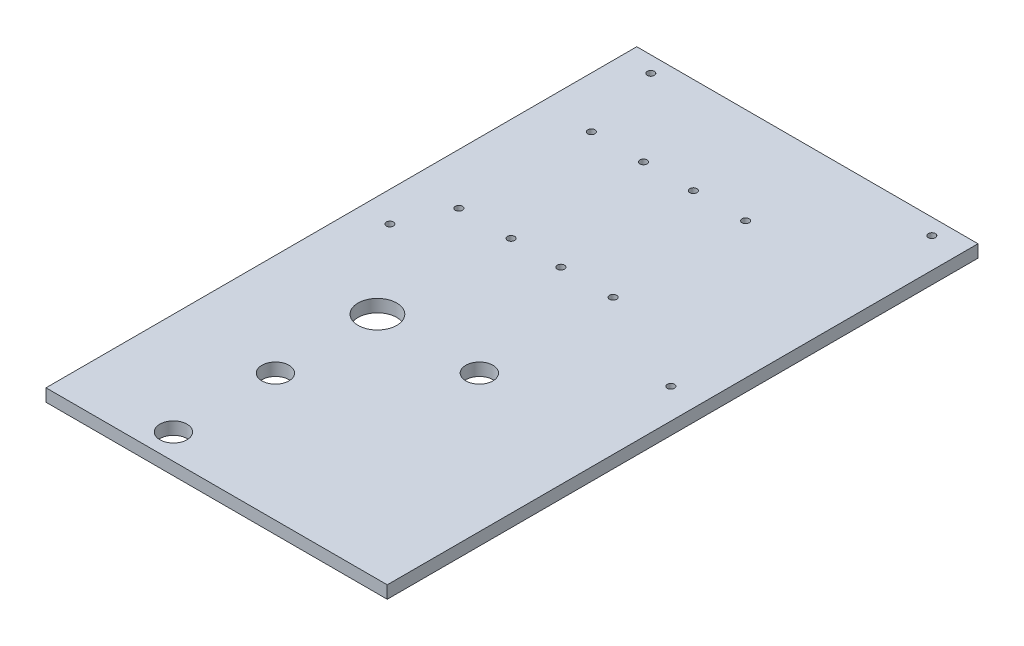
ISO-10303-21;
HEADER;
FILE_DESCRIPTION(('STEP AP214'),'2;1');
FILE_NAME('part.step','',(''),(''),'','','');
FILE_SCHEMA(('AUTOMOTIVE_DESIGN { 1 0 10303 214 1 1 1 1 }'));
ENDSEC;
DATA;
#1=APPLICATION_CONTEXT('core data for automotive mechanical design processes');
#2=APPLICATION_PROTOCOL_DEFINITION('international standard','automotive_design',2000,#1);
#3=PRODUCT_CONTEXT('',#1,'mechanical');
#4=PRODUCT('Part','Part','',(#3));
#5=PRODUCT_RELATED_PRODUCT_CATEGORY('part','',(#4));
#6=PRODUCT_DEFINITION_FORMATION('','',#4);
#7=PRODUCT_DEFINITION_CONTEXT('part definition',#1,'design');
#8=PRODUCT_DEFINITION('design','',#6,#7);
#9=PRODUCT_DEFINITION_SHAPE('','',#8);
#10=(LENGTH_UNIT() NAMED_UNIT(*) SI_UNIT(.MILLI.,.METRE.));
#11=(NAMED_UNIT(*) PLANE_ANGLE_UNIT() SI_UNIT($,.RADIAN.));
#12=(NAMED_UNIT(*) SI_UNIT($,.STERADIAN.) SOLID_ANGLE_UNIT());
#13=UNCERTAINTY_MEASURE_WITH_UNIT(LENGTH_MEASURE(1.E-05),#10,'distance_accuracy_value','');
#14=(GEOMETRIC_REPRESENTATION_CONTEXT(3) GLOBAL_UNCERTAINTY_ASSIGNED_CONTEXT((#13)) GLOBAL_UNIT_ASSIGNED_CONTEXT((#10,
#11,#12)) REPRESENTATION_CONTEXT('',''));
#15=CARTESIAN_POINT('',(0.,0.,0.));
#16=DIRECTION('',(0.,0.,1.));
#17=DIRECTION('',(1.,0.,0.));
#18=AXIS2_PLACEMENT_3D('',#15,#16,#17);
#19=CARTESIAN_POINT('',(0.,3.125,0.));
#20=DIRECTION('',(0.,-1.,0.));
#21=DIRECTION('',(0.,0.,-1.));
#22=AXIS2_PLACEMENT_3D('',#19,#20,#21);
#23=PLANE('',#22);
#24=DIRECTION('',(0.,0.,1.));
#25=VECTOR('',#24,1.);
#26=CARTESIAN_POINT('',(0.,3.125,0.));
#27=LINE('',#26,#25);
#28=CARTESIAN_POINT('',(0.,3.125,-147.15));
#29=VERTEX_POINT('',#28);
#30=CARTESIAN_POINT('',(0.,3.125,0.));
#31=VERTEX_POINT('',#30);
#32=EDGE_CURVE('E96',#29,#31,#27,.T.);
#33=ORIENTED_EDGE('',*,*,#32,.T.);
#34=DIRECTION('',(1.,0.,0.));
#35=VECTOR('',#34,1.);
#36=CARTESIAN_POINT('',(0.,3.125,0.));
#37=LINE('',#36,#35);
#38=CARTESIAN_POINT('',(85.,3.125,0.));
#39=VERTEX_POINT('',#38);
#40=EDGE_CURVE('E91',#31,#39,#37,.T.);
#41=ORIENTED_EDGE('',*,*,#40,.T.);
#42=DIRECTION('',(0.,0.,-1.));
#43=VECTOR('',#42,1.);
#44=CARTESIAN_POINT('',(85.,3.125,0.));
#45=LINE('',#44,#43);
#46=CARTESIAN_POINT('',(85.,3.125,-147.15));
#47=VERTEX_POINT('',#46);
#48=EDGE_CURVE('E94',#39,#47,#45,.T.);
#49=ORIENTED_EDGE('',*,*,#48,.T.);
#50=DIRECTION('',(-1.,0.,0.));
#51=VECTOR('',#50,1.);
#52=CARTESIAN_POINT('',(0.,3.125,-147.15));
#53=LINE('',#52,#51);
#54=EDGE_CURVE('E61',#47,#29,#53,.T.);
#55=ORIENTED_EDGE('',*,*,#54,.T.);
#56=EDGE_LOOP('',(#33,#41,#49,#55));
#57=FACE_BOUND('',#56,.T.);
#58=CARTESIAN_POINT('',(25.4,3.125,-57.15));
#59=DIRECTION('',(0.,1.,0.));
#60=DIRECTION('',(0.,0.,1.));
#61=AXIS2_PLACEMENT_3D('',#58,#59,#60);
#62=CIRCLE('',#61,4.826);
#63=CARTESIAN_POINT('',(25.4,3.125,-52.324));
#64=VERTEX_POINT('',#63);
#65=EDGE_CURVE('E116',#64,#64,#62,.T.);
#66=ORIENTED_EDGE('',*,*,#65,.F.);
#67=EDGE_LOOP('',(#66));
#68=FACE_BOUND('',#67,.T.);
#69=CARTESIAN_POINT('',(25.4,3.125,-31.75));
#70=DIRECTION('',(0.,1.,0.));
#71=DIRECTION('',(0.,0.,1.));
#72=AXIS2_PLACEMENT_3D('',#69,#70,#71);
#73=CIRCLE('',#72,3.38);
#74=CARTESIAN_POINT('',(25.4,3.125,-28.37));
#75=VERTEX_POINT('',#74);
#76=EDGE_CURVE('E138',#75,#75,#73,.T.);
#77=ORIENTED_EDGE('',*,*,#76,.F.);
#78=EDGE_LOOP('',(#77));
#79=FACE_BOUND('',#78,.T.);
#80=CARTESIAN_POINT('',(25.4,3.125,-6.35));
#81=DIRECTION('',(0.,1.,0.));
#82=DIRECTION('',(0.,0.,1.));
#83=AXIS2_PLACEMENT_3D('',#80,#81,#82);
#84=CIRCLE('',#83,3.38);
#85=CARTESIAN_POINT('',(25.4,3.125,-2.97));
#86=VERTEX_POINT('',#85);
#87=EDGE_CURVE('E146',#86,#86,#84,.T.);
#88=ORIENTED_EDGE('',*,*,#87,.F.);
#89=EDGE_LOOP('',(#88));
#90=FACE_BOUND('',#89,.T.);
#91=CARTESIAN_POINT('',(50.8,3.125,-57.15));
#92=DIRECTION('',(0.,1.,0.));
#93=DIRECTION('',(0.,0.,1.));
#94=AXIS2_PLACEMENT_3D('',#91,#92,#93);
#95=CIRCLE('',#94,3.38);
#96=CARTESIAN_POINT('',(50.8,3.125,-53.77));
#97=VERTEX_POINT('',#96);
#98=EDGE_CURVE('E154',#97,#97,#95,.T.);
#99=ORIENTED_EDGE('',*,*,#98,.F.);
#100=EDGE_LOOP('',(#99));
#101=FACE_BOUND('',#100,.T.);
#102=CARTESIAN_POINT('',(7.5,3.125,-143.15));
#103=DIRECTION('',(0.,1.,0.));
#104=DIRECTION('',(0.,0.,1.));
#105=AXIS2_PLACEMENT_3D('',#102,#103,#104);
#106=CIRCLE('',#105,0.889000000000012);
#107=CARTESIAN_POINT('',(7.5,3.125,-142.261));
#108=VERTEX_POINT('',#107);
#109=EDGE_CURVE('E162',#108,#108,#106,.T.);
#110=ORIENTED_EDGE('',*,*,#109,.F.);
#111=EDGE_LOOP('',(#110));
#112=FACE_BOUND('',#111,.T.);
#113=CARTESIAN_POINT('',(77.5,3.125,-143.15));
#114=DIRECTION('',(0.,1.,0.));
#115=DIRECTION('',(0.,0.,1.));
#116=AXIS2_PLACEMENT_3D('',#113,#114,#115);
#117=CIRCLE('',#116,0.889000000000006);
#118=CARTESIAN_POINT('',(77.5,3.125,-142.261));
#119=VERTEX_POINT('',#118);
#120=EDGE_CURVE('E170',#119,#119,#117,.T.);
#121=ORIENTED_EDGE('',*,*,#120,.F.);
#122=EDGE_LOOP('',(#121));
#123=FACE_BOUND('',#122,.T.);
#124=CARTESIAN_POINT('',(77.5,3.125,-78.15));
#125=DIRECTION('',(0.,1.,0.));
#126=DIRECTION('',(0.,0.,1.));
#127=AXIS2_PLACEMENT_3D('',#124,#125,#126);
#128=CIRCLE('',#127,0.889000000000002);
#129=CARTESIAN_POINT('',(77.5,3.125,-77.261));
#130=VERTEX_POINT('',#129);
#131=EDGE_CURVE('E178',#130,#130,#128,.T.);
#132=ORIENTED_EDGE('',*,*,#131,.F.);
#133=EDGE_LOOP('',(#132));
#134=FACE_BOUND('',#133,.T.);
#135=CARTESIAN_POINT('',(7.50000000000001,3.125,-78.15));
#136=DIRECTION('',(0.,1.,0.));
#137=DIRECTION('',(0.,0.,1.));
#138=AXIS2_PLACEMENT_3D('',#135,#136,#137);
#139=CIRCLE('',#138,0.889);
#140=CARTESIAN_POINT('',(7.50000000000001,3.125,-77.261));
#141=VERTEX_POINT('',#140);
#142=EDGE_CURVE('E186',#141,#141,#139,.T.);
#143=ORIENTED_EDGE('',*,*,#142,.F.);
#144=EDGE_LOOP('',(#143));
#145=FACE_BOUND('',#144,.T.);
#146=CARTESIAN_POINT('',(12.7,3.125,-123.15));
#147=DIRECTION('',(0.,1.,0.));
#148=DIRECTION('',(0.,0.,1.));
#149=AXIS2_PLACEMENT_3D('',#146,#147,#148);
#150=CIRCLE('',#149,0.889000000000021);
#151=CARTESIAN_POINT('',(12.7,3.125,-122.261));
#152=VERTEX_POINT('',#151);
#153=EDGE_CURVE('E194',#152,#152,#150,.T.);
#154=ORIENTED_EDGE('',*,*,#153,.F.);
#155=EDGE_LOOP('',(#154));
#156=FACE_BOUND('',#155,.T.);
#157=CARTESIAN_POINT('',(25.7,3.125,-90.15));
#158=DIRECTION('',(0.,1.,0.));
#159=DIRECTION('',(0.,0.,1.));
#160=AXIS2_PLACEMENT_3D('',#157,#158,#159);
#161=CIRCLE('',#160,0.888999999999996);
#162=CARTESIAN_POINT('',(25.7,3.125,-89.261));
#163=VERTEX_POINT('',#162);
#164=EDGE_CURVE('E202',#163,#163,#161,.T.);
#165=ORIENTED_EDGE('',*,*,#164,.F.);
#166=EDGE_LOOP('',(#165));
#167=FACE_BOUND('',#166,.T.);
#168=CARTESIAN_POINT('',(25.7,3.125,-123.15));
#169=DIRECTION('',(0.,1.,0.));
#170=DIRECTION('',(0.,0.,1.));
#171=AXIS2_PLACEMENT_3D('',#168,#169,#170);
#172=CIRCLE('',#171,0.889000000000026);
#173=CARTESIAN_POINT('',(25.7,3.125,-122.261));
#174=VERTEX_POINT('',#173);
#175=EDGE_CURVE('E210',#174,#174,#172,.T.);
#176=ORIENTED_EDGE('',*,*,#175,.F.);
#177=EDGE_LOOP('',(#176));
#178=FACE_BOUND('',#177,.T.);
#179=CARTESIAN_POINT('',(12.7,3.125,-90.15));
#180=DIRECTION('',(0.,1.,0.));
#181=DIRECTION('',(0.,0.,1.));
#182=AXIS2_PLACEMENT_3D('',#179,#180,#181);
#183=CIRCLE('',#182,0.888999999999996);
#184=CARTESIAN_POINT('',(12.7,3.125,-89.261));
#185=VERTEX_POINT('',#184);
#186=EDGE_CURVE('E218',#185,#185,#183,.T.);
#187=ORIENTED_EDGE('',*,*,#186,.F.);
#188=EDGE_LOOP('',(#187));
#189=FACE_BOUND('',#188,.T.);
#190=CARTESIAN_POINT('',(38.1,3.125,-123.15));
#191=DIRECTION('',(0.,1.,0.));
#192=DIRECTION('',(0.,0.,1.));
#193=AXIS2_PLACEMENT_3D('',#190,#191,#192);
#194=CIRCLE('',#193,0.889000000000026);
#195=CARTESIAN_POINT('',(38.1,3.125,-122.261));
#196=VERTEX_POINT('',#195);
#197=EDGE_CURVE('E226',#196,#196,#194,.T.);
#198=ORIENTED_EDGE('',*,*,#197,.F.);
#199=EDGE_LOOP('',(#198));
#200=FACE_BOUND('',#199,.T.);
#201=CARTESIAN_POINT('',(51.1,3.125,-90.15));
#202=DIRECTION('',(0.,1.,0.));
#203=DIRECTION('',(0.,0.,1.));
#204=AXIS2_PLACEMENT_3D('',#201,#202,#203);
#205=CIRCLE('',#204,0.888999999999989);
#206=CARTESIAN_POINT('',(51.1,3.125,-89.261));
#207=VERTEX_POINT('',#206);
#208=EDGE_CURVE('E234',#207,#207,#205,.T.);
#209=ORIENTED_EDGE('',*,*,#208,.F.);
#210=EDGE_LOOP('',(#209));
#211=FACE_BOUND('',#210,.T.);
#212=CARTESIAN_POINT('',(51.1,3.125,-123.15));
#213=DIRECTION('',(0.,1.,0.));
#214=DIRECTION('',(0.,0.,1.));
#215=AXIS2_PLACEMENT_3D('',#212,#213,#214);
#216=CIRCLE('',#215,0.889000000000026);
#217=CARTESIAN_POINT('',(51.1,3.125,-122.261));
#218=VERTEX_POINT('',#217);
#219=EDGE_CURVE('E242',#218,#218,#216,.T.);
#220=ORIENTED_EDGE('',*,*,#219,.F.);
#221=EDGE_LOOP('',(#220));
#222=FACE_BOUND('',#221,.T.);
#223=CARTESIAN_POINT('',(38.1,3.125,-90.15));
#224=DIRECTION('',(0.,1.,0.));
#225=DIRECTION('',(0.,0.,1.));
#226=AXIS2_PLACEMENT_3D('',#223,#224,#225);
#227=CIRCLE('',#226,0.888999999999996);
#228=CARTESIAN_POINT('',(38.1,3.125,-89.261));
#229=VERTEX_POINT('',#228);
#230=EDGE_CURVE('E250',#229,#229,#227,.T.);
#231=ORIENTED_EDGE('',*,*,#230,.F.);
#232=EDGE_LOOP('',(#231));
#233=FACE_BOUND('',#232,.T.);
#234=ADVANCED_FACE('F43',(#57,#68,#79,#90,#101,#112,#123,#134,#145,#156,#167,#178,#189,#200,
#211,#222,#233),#23,.F.);
#235=CARTESIAN_POINT('',(0.,0.,0.));
#236=DIRECTION('',(0.,-1.,0.));
#237=DIRECTION('',(0.,0.,-1.));
#238=AXIS2_PLACEMENT_3D('',#235,#236,#237);
#239=PLANE('',#238);
#240=CARTESIAN_POINT('',(51.1,0.,-123.15));
#241=DIRECTION('',(0.,1.,0.));
#242=DIRECTION('',(0.,0.,1.));
#243=AXIS2_PLACEMENT_3D('',#240,#241,#242);
#244=CIRCLE('',#243,0.889000000000026);
#245=CARTESIAN_POINT('',(51.1,0.,-122.261));
#246=VERTEX_POINT('',#245);
#247=EDGE_CURVE('E246',#246,#246,#244,.T.);
#248=ORIENTED_EDGE('',*,*,#247,.T.);
#249=EDGE_LOOP('',(#248));
#250=FACE_BOUND('',#249,.T.);
#251=CARTESIAN_POINT('',(38.1,0.,-123.15));
#252=DIRECTION('',(0.,1.,0.));
#253=DIRECTION('',(0.,0.,1.));
#254=AXIS2_PLACEMENT_3D('',#251,#252,#253);
#255=CIRCLE('',#254,0.889000000000026);
#256=CARTESIAN_POINT('',(38.1,0.,-122.261));
#257=VERTEX_POINT('',#256);
#258=EDGE_CURVE('E230',#257,#257,#255,.T.);
#259=ORIENTED_EDGE('',*,*,#258,.T.);
#260=EDGE_LOOP('',(#259));
#261=FACE_BOUND('',#260,.T.);
#262=CARTESIAN_POINT('',(25.7,0.,-123.15));
#263=DIRECTION('',(0.,1.,0.));
#264=DIRECTION('',(0.,0.,1.));
#265=AXIS2_PLACEMENT_3D('',#262,#263,#264);
#266=CIRCLE('',#265,0.889000000000026);
#267=CARTESIAN_POINT('',(25.7,0.,-122.261));
#268=VERTEX_POINT('',#267);
#269=EDGE_CURVE('E214',#268,#268,#266,.T.);
#270=ORIENTED_EDGE('',*,*,#269,.T.);
#271=EDGE_LOOP('',(#270));
#272=FACE_BOUND('',#271,.T.);
#273=CARTESIAN_POINT('',(12.7,0.,-123.15));
#274=DIRECTION('',(0.,1.,0.));
#275=DIRECTION('',(0.,0.,1.));
#276=AXIS2_PLACEMENT_3D('',#273,#274,#275);
#277=CIRCLE('',#276,0.889000000000021);
#278=CARTESIAN_POINT('',(12.7,0.,-122.261));
#279=VERTEX_POINT('',#278);
#280=EDGE_CURVE('E198',#279,#279,#277,.T.);
#281=ORIENTED_EDGE('',*,*,#280,.T.);
#282=EDGE_LOOP('',(#281));
#283=FACE_BOUND('',#282,.T.);
#284=CARTESIAN_POINT('',(77.5,0.,-78.15));
#285=DIRECTION('',(0.,1.,0.));
#286=DIRECTION('',(0.,0.,1.));
#287=AXIS2_PLACEMENT_3D('',#284,#285,#286);
#288=CIRCLE('',#287,0.889000000000002);
#289=CARTESIAN_POINT('',(77.5,0.,-77.261));
#290=VERTEX_POINT('',#289);
#291=EDGE_CURVE('E182',#290,#290,#288,.T.);
#292=ORIENTED_EDGE('',*,*,#291,.T.);
#293=EDGE_LOOP('',(#292));
#294=FACE_BOUND('',#293,.T.);
#295=CARTESIAN_POINT('',(7.5,0.,-143.15));
#296=DIRECTION('',(0.,1.,0.));
#297=DIRECTION('',(0.,0.,1.));
#298=AXIS2_PLACEMENT_3D('',#295,#296,#297);
#299=CIRCLE('',#298,0.889000000000012);
#300=CARTESIAN_POINT('',(7.5,0.,-142.261));
#301=VERTEX_POINT('',#300);
#302=EDGE_CURVE('E166',#301,#301,#299,.T.);
#303=ORIENTED_EDGE('',*,*,#302,.T.);
#304=EDGE_LOOP('',(#303));
#305=FACE_BOUND('',#304,.T.);
#306=CARTESIAN_POINT('',(25.4,0.,-6.35));
#307=DIRECTION('',(0.,1.,0.));
#308=DIRECTION('',(0.,0.,1.));
#309=AXIS2_PLACEMENT_3D('',#306,#307,#308);
#310=CIRCLE('',#309,3.38);
#311=CARTESIAN_POINT('',(25.4,0.,-2.97));
#312=VERTEX_POINT('',#311);
#313=EDGE_CURVE('E150',#312,#312,#310,.T.);
#314=ORIENTED_EDGE('',*,*,#313,.T.);
#315=EDGE_LOOP('',(#314));
#316=FACE_BOUND('',#315,.T.);
#317=CARTESIAN_POINT('',(25.4,0.,-57.15));
#318=DIRECTION('',(0.,1.,0.));
#319=DIRECTION('',(0.,0.,1.));
#320=AXIS2_PLACEMENT_3D('',#317,#318,#319);
#321=CIRCLE('',#320,4.826);
#322=CARTESIAN_POINT('',(25.4,0.,-52.324));
#323=VERTEX_POINT('',#322);
#324=EDGE_CURVE('E134',#323,#323,#321,.T.);
#325=ORIENTED_EDGE('',*,*,#324,.T.);
#326=EDGE_LOOP('',(#325));
#327=FACE_BOUND('',#326,.T.);
#328=DIRECTION('',(0.,0.,1.));
#329=VECTOR('',#328,1.);
#330=CARTESIAN_POINT('',(0.,0.,0.));
#331=LINE('',#330,#329);
#332=CARTESIAN_POINT('',(0.,0.,-147.15));
#333=VERTEX_POINT('',#332);
#334=CARTESIAN_POINT('',(0.,0.,0.));
#335=VERTEX_POINT('',#334);
#336=EDGE_CURVE('E112',#333,#335,#331,.T.);
#337=ORIENTED_EDGE('',*,*,#336,.F.);
#338=DIRECTION('',(-1.,0.,0.));
#339=VECTOR('',#338,1.);
#340=CARTESIAN_POINT('',(0.,0.,-147.15));
#341=LINE('',#340,#339);
#342=CARTESIAN_POINT('',(85.,0.,-147.15));
#343=VERTEX_POINT('',#342);
#344=EDGE_CURVE('E84',#343,#333,#341,.T.);
#345=ORIENTED_EDGE('',*,*,#344,.F.);
#346=DIRECTION('',(0.,0.,-1.));
#347=VECTOR('',#346,1.);
#348=CARTESIAN_POINT('',(85.,0.,0.));
#349=LINE('',#348,#347);
#350=CARTESIAN_POINT('',(85.,0.,0.));
#351=VERTEX_POINT('',#350);
#352=EDGE_CURVE('E78',#351,#343,#349,.T.);
#353=ORIENTED_EDGE('',*,*,#352,.F.);
#354=DIRECTION('',(1.,0.,0.));
#355=VECTOR('',#354,1.);
#356=CARTESIAN_POINT('',(0.,0.,0.));
#357=LINE('',#356,#355);
#358=EDGE_CURVE('E101',#335,#351,#357,.T.);
#359=ORIENTED_EDGE('',*,*,#358,.F.);
#360=EDGE_LOOP('',(#337,#345,#353,#359));
#361=FACE_BOUND('',#360,.T.);
#362=CARTESIAN_POINT('',(25.4,0.,-31.75));
#363=DIRECTION('',(0.,1.,0.));
#364=DIRECTION('',(0.,0.,1.));
#365=AXIS2_PLACEMENT_3D('',#362,#363,#364);
#366=CIRCLE('',#365,3.38);
#367=CARTESIAN_POINT('',(25.4,0.,-28.37));
#368=VERTEX_POINT('',#367);
#369=EDGE_CURVE('E142',#368,#368,#366,.T.);
#370=ORIENTED_EDGE('',*,*,#369,.T.);
#371=EDGE_LOOP('',(#370));
#372=FACE_BOUND('',#371,.T.);
#373=CARTESIAN_POINT('',(50.8,0.,-57.15));
#374=DIRECTION('',(0.,1.,0.));
#375=DIRECTION('',(0.,0.,1.));
#376=AXIS2_PLACEMENT_3D('',#373,#374,#375);
#377=CIRCLE('',#376,3.38);
#378=CARTESIAN_POINT('',(50.8,0.,-53.77));
#379=VERTEX_POINT('',#378);
#380=EDGE_CURVE('E158',#379,#379,#377,.T.);
#381=ORIENTED_EDGE('',*,*,#380,.T.);
#382=EDGE_LOOP('',(#381));
#383=FACE_BOUND('',#382,.T.);
#384=CARTESIAN_POINT('',(77.5,0.,-143.15));
#385=DIRECTION('',(0.,1.,0.));
#386=DIRECTION('',(0.,0.,1.));
#387=AXIS2_PLACEMENT_3D('',#384,#385,#386);
#388=CIRCLE('',#387,0.889000000000006);
#389=CARTESIAN_POINT('',(77.5,0.,-142.261));
#390=VERTEX_POINT('',#389);
#391=EDGE_CURVE('E174',#390,#390,#388,.T.);
#392=ORIENTED_EDGE('',*,*,#391,.T.);
#393=EDGE_LOOP('',(#392));
#394=FACE_BOUND('',#393,.T.);
#395=CARTESIAN_POINT('',(7.50000000000001,0.,-78.15));
#396=DIRECTION('',(0.,1.,0.));
#397=DIRECTION('',(0.,0.,1.));
#398=AXIS2_PLACEMENT_3D('',#395,#396,#397);
#399=CIRCLE('',#398,0.889);
#400=CARTESIAN_POINT('',(7.50000000000001,0.,-77.261));
#401=VERTEX_POINT('',#400);
#402=EDGE_CURVE('E190',#401,#401,#399,.T.);
#403=ORIENTED_EDGE('',*,*,#402,.T.);
#404=EDGE_LOOP('',(#403));
#405=FACE_BOUND('',#404,.T.);
#406=CARTESIAN_POINT('',(25.7,0.,-90.15));
#407=DIRECTION('',(0.,1.,0.));
#408=DIRECTION('',(0.,0.,1.));
#409=AXIS2_PLACEMENT_3D('',#406,#407,#408);
#410=CIRCLE('',#409,0.888999999999996);
#411=CARTESIAN_POINT('',(25.7,0.,-89.261));
#412=VERTEX_POINT('',#411);
#413=EDGE_CURVE('E206',#412,#412,#410,.T.);
#414=ORIENTED_EDGE('',*,*,#413,.T.);
#415=EDGE_LOOP('',(#414));
#416=FACE_BOUND('',#415,.T.);
#417=CARTESIAN_POINT('',(12.7,0.,-90.15));
#418=DIRECTION('',(0.,1.,0.));
#419=DIRECTION('',(0.,0.,1.));
#420=AXIS2_PLACEMENT_3D('',#417,#418,#419);
#421=CIRCLE('',#420,0.888999999999996);
#422=CARTESIAN_POINT('',(12.7,0.,-89.261));
#423=VERTEX_POINT('',#422);
#424=EDGE_CURVE('E222',#423,#423,#421,.T.);
#425=ORIENTED_EDGE('',*,*,#424,.T.);
#426=EDGE_LOOP('',(#425));
#427=FACE_BOUND('',#426,.T.);
#428=CARTESIAN_POINT('',(51.1,0.,-90.15));
#429=DIRECTION('',(0.,1.,0.));
#430=DIRECTION('',(0.,0.,1.));
#431=AXIS2_PLACEMENT_3D('',#428,#429,#430);
#432=CIRCLE('',#431,0.888999999999989);
#433=CARTESIAN_POINT('',(51.1,0.,-89.261));
#434=VERTEX_POINT('',#433);
#435=EDGE_CURVE('E238',#434,#434,#432,.T.);
#436=ORIENTED_EDGE('',*,*,#435,.T.);
#437=EDGE_LOOP('',(#436));
#438=FACE_BOUND('',#437,.T.);
#439=CARTESIAN_POINT('',(38.1,0.,-90.15));
#440=DIRECTION('',(0.,1.,0.));
#441=DIRECTION('',(0.,0.,1.));
#442=AXIS2_PLACEMENT_3D('',#439,#440,#441);
#443=CIRCLE('',#442,0.888999999999996);
#444=CARTESIAN_POINT('',(38.1,0.,-89.261));
#445=VERTEX_POINT('',#444);
#446=EDGE_CURVE('E254',#445,#445,#443,.T.);
#447=ORIENTED_EDGE('',*,*,#446,.T.);
#448=EDGE_LOOP('',(#447));
#449=FACE_BOUND('',#448,.T.);
#450=ADVANCED_FACE('F129',(#250,#261,#272,#283,#294,#305,#316,#327,#361,#372,#383,#394,#405,
#416,#427,#438,#449),#239,.T.);
#451=CARTESIAN_POINT('',(0.,3.125,0.));
#452=DIRECTION('',(1.,0.,0.));
#453=DIRECTION('',(0.,0.,-1.));
#454=AXIS2_PLACEMENT_3D('',#451,#452,#453);
#455=PLANE('',#454);
#456=ORIENTED_EDGE('',*,*,#336,.T.);
#457=DIRECTION('',(0.,-1.,0.));
#458=VECTOR('',#457,1.);
#459=CARTESIAN_POINT('',(0.,3.125,0.));
#460=LINE('',#459,#458);
#461=EDGE_CURVE('E11',#31,#335,#460,.T.);
#462=ORIENTED_EDGE('',*,*,#461,.F.);
#463=ORIENTED_EDGE('',*,*,#32,.F.);
#464=DIRECTION('',(0.,-1.,0.));
#465=VECTOR('',#464,1.);
#466=CARTESIAN_POINT('',(0.,3.125,-147.15));
#467=LINE('',#466,#465);
#468=EDGE_CURVE('E108',#29,#333,#467,.T.);
#469=ORIENTED_EDGE('',*,*,#468,.T.);
#470=EDGE_LOOP('',(#456,#462,#463,#469));
#471=FACE_BOUND('',#470,.T.);
#472=ADVANCED_FACE('F45',(#471),#455,.F.);
#473=CARTESIAN_POINT('',(0.,3.125,0.));
#474=DIRECTION('',(0.,0.,-1.));
#475=DIRECTION('',(-1.,0.,0.));
#476=AXIS2_PLACEMENT_3D('',#473,#474,#475);
#477=PLANE('',#476);
#478=ORIENTED_EDGE('',*,*,#358,.T.);
#479=DIRECTION('',(0.,-1.,0.));
#480=VECTOR('',#479,1.);
#481=CARTESIAN_POINT('',(85.,3.125,0.));
#482=LINE('',#481,#480);
#483=EDGE_CURVE('E53',#39,#351,#482,.T.);
#484=ORIENTED_EDGE('',*,*,#483,.F.);
#485=ORIENTED_EDGE('',*,*,#40,.F.);
#486=ORIENTED_EDGE('',*,*,#461,.T.);
#487=EDGE_LOOP('',(#478,#484,#485,#486));
#488=FACE_BOUND('',#487,.T.);
#489=ADVANCED_FACE('F100',(#488),#477,.F.);
#490=CARTESIAN_POINT('',(85.,3.125,0.));
#491=DIRECTION('',(-1.,0.,0.));
#492=DIRECTION('',(0.,0.,1.));
#493=AXIS2_PLACEMENT_3D('',#490,#491,#492);
#494=PLANE('',#493);
#495=ORIENTED_EDGE('',*,*,#352,.T.);
#496=DIRECTION('',(0.,-1.,0.));
#497=VECTOR('',#496,1.);
#498=CARTESIAN_POINT('',(85.,3.125,-147.15));
#499=LINE('',#498,#497);
#500=EDGE_CURVE('E103',#47,#343,#499,.T.);
#501=ORIENTED_EDGE('',*,*,#500,.F.);
#502=ORIENTED_EDGE('',*,*,#48,.F.);
#503=ORIENTED_EDGE('',*,*,#483,.T.);
#504=EDGE_LOOP('',(#495,#501,#502,#503));
#505=FACE_BOUND('',#504,.T.);
#506=ADVANCED_FACE('F104',(#505),#494,.F.);
#507=CARTESIAN_POINT('',(0.,3.125,-147.15));
#508=DIRECTION('',(0.,0.,1.));
#509=DIRECTION('',(1.,0.,0.));
#510=AXIS2_PLACEMENT_3D('',#507,#508,#509);
#511=PLANE('',#510);
#512=ORIENTED_EDGE('',*,*,#344,.T.);
#513=ORIENTED_EDGE('',*,*,#468,.F.);
#514=ORIENTED_EDGE('',*,*,#54,.F.);
#515=ORIENTED_EDGE('',*,*,#500,.T.);
#516=EDGE_LOOP('',(#512,#513,#514,#515));
#517=FACE_BOUND('',#516,.T.);
#518=ADVANCED_FACE('F126',(#517),#511,.F.);
#519=CARTESIAN_POINT('',(25.4,3.125,-57.15));
#520=DIRECTION('',(0.,-1.,0.));
#521=DIRECTION('',(0.,0.,-1.));
#522=AXIS2_PLACEMENT_3D('',#519,#520,#521);
#523=CYLINDRICAL_SURFACE('',#522,4.826);
#524=ORIENTED_EDGE('',*,*,#65,.T.);
#525=EDGE_LOOP('',(#524));
#526=FACE_BOUND('',#525,.T.);
#527=ORIENTED_EDGE('',*,*,#324,.F.);
#528=EDGE_LOOP('',(#527));
#529=FACE_BOUND('',#528,.T.);
#530=ADVANCED_FACE('F273',(#526,#529),#523,.F.);
#531=CARTESIAN_POINT('',(25.4,3.125,-31.75));
#532=DIRECTION('',(0.,-1.,0.));
#533=DIRECTION('',(0.,0.,-1.));
#534=AXIS2_PLACEMENT_3D('',#531,#532,#533);
#535=CYLINDRICAL_SURFACE('',#534,3.38);
#536=ORIENTED_EDGE('',*,*,#76,.T.);
#537=EDGE_LOOP('',(#536));
#538=FACE_BOUND('',#537,.T.);
#539=ORIENTED_EDGE('',*,*,#369,.F.);
#540=EDGE_LOOP('',(#539));
#541=FACE_BOUND('',#540,.T.);
#542=ADVANCED_FACE('F327',(#538,#541),#535,.F.);
#543=CARTESIAN_POINT('',(25.4,3.125,-6.35));
#544=DIRECTION('',(0.,-1.,0.));
#545=DIRECTION('',(0.,0.,-1.));
#546=AXIS2_PLACEMENT_3D('',#543,#544,#545);
#547=CYLINDRICAL_SURFACE('',#546,3.38);
#548=ORIENTED_EDGE('',*,*,#87,.T.);
#549=EDGE_LOOP('',(#548));
#550=FACE_BOUND('',#549,.T.);
#551=ORIENTED_EDGE('',*,*,#313,.F.);
#552=EDGE_LOOP('',(#551));
#553=FACE_BOUND('',#552,.T.);
#554=ADVANCED_FACE('F336',(#550,#553),#547,.F.);
#555=CARTESIAN_POINT('',(50.8,3.125,-57.15));
#556=DIRECTION('',(0.,-1.,0.));
#557=DIRECTION('',(0.,0.,-1.));
#558=AXIS2_PLACEMENT_3D('',#555,#556,#557);
#559=CYLINDRICAL_SURFACE('',#558,3.38);
#560=ORIENTED_EDGE('',*,*,#98,.T.);
#561=EDGE_LOOP('',(#560));
#562=FACE_BOUND('',#561,.T.);
#563=ORIENTED_EDGE('',*,*,#380,.F.);
#564=EDGE_LOOP('',(#563));
#565=FACE_BOUND('',#564,.T.);
#566=ADVANCED_FACE('F345',(#562,#565),#559,.F.);
#567=CARTESIAN_POINT('',(7.5,3.125,-143.15));
#568=DIRECTION('',(0.,-1.,0.));
#569=DIRECTION('',(0.,0.,-1.));
#570=AXIS2_PLACEMENT_3D('',#567,#568,#569);
#571=CYLINDRICAL_SURFACE('',#570,0.889000000000012);
#572=ORIENTED_EDGE('',*,*,#109,.T.);
#573=EDGE_LOOP('',(#572));
#574=FACE_BOUND('',#573,.T.);
#575=ORIENTED_EDGE('',*,*,#302,.F.);
#576=EDGE_LOOP('',(#575));
#577=FACE_BOUND('',#576,.T.);
#578=ADVANCED_FACE('F355',(#574,#577),#571,.F.);
#579=CARTESIAN_POINT('',(77.5,3.125,-143.15));
#580=DIRECTION('',(0.,-1.,0.));
#581=DIRECTION('',(0.,0.,-1.));
#582=AXIS2_PLACEMENT_3D('',#579,#580,#581);
#583=CYLINDRICAL_SURFACE('',#582,0.889000000000006);
#584=ORIENTED_EDGE('',*,*,#120,.T.);
#585=EDGE_LOOP('',(#584));
#586=FACE_BOUND('',#585,.T.);
#587=ORIENTED_EDGE('',*,*,#391,.F.);
#588=EDGE_LOOP('',(#587));
#589=FACE_BOUND('',#588,.T.);
#590=ADVANCED_FACE('F365',(#586,#589),#583,.F.);
#591=CARTESIAN_POINT('',(77.5,3.125,-78.15));
#592=DIRECTION('',(0.,-1.,0.));
#593=DIRECTION('',(0.,0.,-1.));
#594=AXIS2_PLACEMENT_3D('',#591,#592,#593);
#595=CYLINDRICAL_SURFACE('',#594,0.889000000000002);
#596=ORIENTED_EDGE('',*,*,#131,.T.);
#597=EDGE_LOOP('',(#596));
#598=FACE_BOUND('',#597,.T.);
#599=ORIENTED_EDGE('',*,*,#291,.F.);
#600=EDGE_LOOP('',(#599));
#601=FACE_BOUND('',#600,.T.);
#602=ADVANCED_FACE('F375',(#598,#601),#595,.F.);
#603=CARTESIAN_POINT('',(7.50000000000001,3.125,-78.15));
#604=DIRECTION('',(0.,-1.,0.));
#605=DIRECTION('',(0.,0.,-1.));
#606=AXIS2_PLACEMENT_3D('',#603,#604,#605);
#607=CYLINDRICAL_SURFACE('',#606,0.889);
#608=ORIENTED_EDGE('',*,*,#142,.T.);
#609=EDGE_LOOP('',(#608));
#610=FACE_BOUND('',#609,.T.);
#611=ORIENTED_EDGE('',*,*,#402,.F.);
#612=EDGE_LOOP('',(#611));
#613=FACE_BOUND('',#612,.T.);
#614=ADVANCED_FACE('F385',(#610,#613),#607,.F.);
#615=CARTESIAN_POINT('',(12.7,3.125,-123.15));
#616=DIRECTION('',(0.,-1.,0.));
#617=DIRECTION('',(0.,0.,-1.));
#618=AXIS2_PLACEMENT_3D('',#615,#616,#617);
#619=CYLINDRICAL_SURFACE('',#618,0.889000000000021);
#620=ORIENTED_EDGE('',*,*,#153,.T.);
#621=EDGE_LOOP('',(#620));
#622=FACE_BOUND('',#621,.T.);
#623=ORIENTED_EDGE('',*,*,#280,.F.);
#624=EDGE_LOOP('',(#623));
#625=FACE_BOUND('',#624,.T.);
#626=ADVANCED_FACE('F395',(#622,#625),#619,.F.);
#627=CARTESIAN_POINT('',(25.7,3.125,-90.15));
#628=DIRECTION('',(0.,-1.,0.));
#629=DIRECTION('',(0.,0.,-1.));
#630=AXIS2_PLACEMENT_3D('',#627,#628,#629);
#631=CYLINDRICAL_SURFACE('',#630,0.888999999999996);
#632=ORIENTED_EDGE('',*,*,#164,.T.);
#633=EDGE_LOOP('',(#632));
#634=FACE_BOUND('',#633,.T.);
#635=ORIENTED_EDGE('',*,*,#413,.F.);
#636=EDGE_LOOP('',(#635));
#637=FACE_BOUND('',#636,.T.);
#638=ADVANCED_FACE('F405',(#634,#637),#631,.F.);
#639=CARTESIAN_POINT('',(25.7,3.125,-123.15));
#640=DIRECTION('',(0.,-1.,0.));
#641=DIRECTION('',(0.,0.,-1.));
#642=AXIS2_PLACEMENT_3D('',#639,#640,#641);
#643=CYLINDRICAL_SURFACE('',#642,0.889000000000026);
#644=ORIENTED_EDGE('',*,*,#175,.T.);
#645=EDGE_LOOP('',(#644));
#646=FACE_BOUND('',#645,.T.);
#647=ORIENTED_EDGE('',*,*,#269,.F.);
#648=EDGE_LOOP('',(#647));
#649=FACE_BOUND('',#648,.T.);
#650=ADVANCED_FACE('F415',(#646,#649),#643,.F.);
#651=CARTESIAN_POINT('',(12.7,3.125,-90.15));
#652=DIRECTION('',(0.,-1.,0.));
#653=DIRECTION('',(0.,0.,-1.));
#654=AXIS2_PLACEMENT_3D('',#651,#652,#653);
#655=CYLINDRICAL_SURFACE('',#654,0.888999999999996);
#656=ORIENTED_EDGE('',*,*,#186,.T.);
#657=EDGE_LOOP('',(#656));
#658=FACE_BOUND('',#657,.T.);
#659=ORIENTED_EDGE('',*,*,#424,.F.);
#660=EDGE_LOOP('',(#659));
#661=FACE_BOUND('',#660,.T.);
#662=ADVANCED_FACE('F425',(#658,#661),#655,.F.);
#663=CARTESIAN_POINT('',(38.1,3.125,-123.15));
#664=DIRECTION('',(0.,-1.,0.));
#665=DIRECTION('',(0.,0.,-1.));
#666=AXIS2_PLACEMENT_3D('',#663,#664,#665);
#667=CYLINDRICAL_SURFACE('',#666,0.889000000000026);
#668=ORIENTED_EDGE('',*,*,#197,.T.);
#669=EDGE_LOOP('',(#668));
#670=FACE_BOUND('',#669,.T.);
#671=ORIENTED_EDGE('',*,*,#258,.F.);
#672=EDGE_LOOP('',(#671));
#673=FACE_BOUND('',#672,.T.);
#674=ADVANCED_FACE('F435',(#670,#673),#667,.F.);
#675=CARTESIAN_POINT('',(51.1,3.125,-90.15));
#676=DIRECTION('',(0.,-1.,0.));
#677=DIRECTION('',(0.,0.,-1.));
#678=AXIS2_PLACEMENT_3D('',#675,#676,#677);
#679=CYLINDRICAL_SURFACE('',#678,0.888999999999989);
#680=ORIENTED_EDGE('',*,*,#208,.T.);
#681=EDGE_LOOP('',(#680));
#682=FACE_BOUND('',#681,.T.);
#683=ORIENTED_EDGE('',*,*,#435,.F.);
#684=EDGE_LOOP('',(#683));
#685=FACE_BOUND('',#684,.T.);
#686=ADVANCED_FACE('F445',(#682,#685),#679,.F.);
#687=CARTESIAN_POINT('',(51.1,3.125,-123.15));
#688=DIRECTION('',(0.,-1.,0.));
#689=DIRECTION('',(0.,0.,-1.));
#690=AXIS2_PLACEMENT_3D('',#687,#688,#689);
#691=CYLINDRICAL_SURFACE('',#690,0.889000000000026);
#692=ORIENTED_EDGE('',*,*,#219,.T.);
#693=EDGE_LOOP('',(#692));
#694=FACE_BOUND('',#693,.T.);
#695=ORIENTED_EDGE('',*,*,#247,.F.);
#696=EDGE_LOOP('',(#695));
#697=FACE_BOUND('',#696,.T.);
#698=ADVANCED_FACE('F455',(#694,#697),#691,.F.);
#699=CARTESIAN_POINT('',(38.1,3.125,-90.15));
#700=DIRECTION('',(0.,-1.,0.));
#701=DIRECTION('',(0.,0.,-1.));
#702=AXIS2_PLACEMENT_3D('',#699,#700,#701);
#703=CYLINDRICAL_SURFACE('',#702,0.888999999999996);
#704=ORIENTED_EDGE('',*,*,#230,.T.);
#705=EDGE_LOOP('',(#704));
#706=FACE_BOUND('',#705,.T.);
#707=ORIENTED_EDGE('',*,*,#446,.F.);
#708=EDGE_LOOP('',(#707));
#709=FACE_BOUND('',#708,.T.);
#710=ADVANCED_FACE('F262',(#706,#709),#703,.F.);
#711=CLOSED_SHELL('',(#234,#450,#472,#489,#506,#518,#530,#542,#554,#566,#578,#590,#602,#614,
#626,#638,#650,#662,#674,#686,#698,#710));
#712=MANIFOLD_SOLID_BREP('B2',#711);
#713=ADVANCED_BREP_SHAPE_REPRESENTATION('',(#18,#712),#14);
#714=SHAPE_DEFINITION_REPRESENTATION(#9,#713);
ENDSEC;
END-ISO-10303-21;
